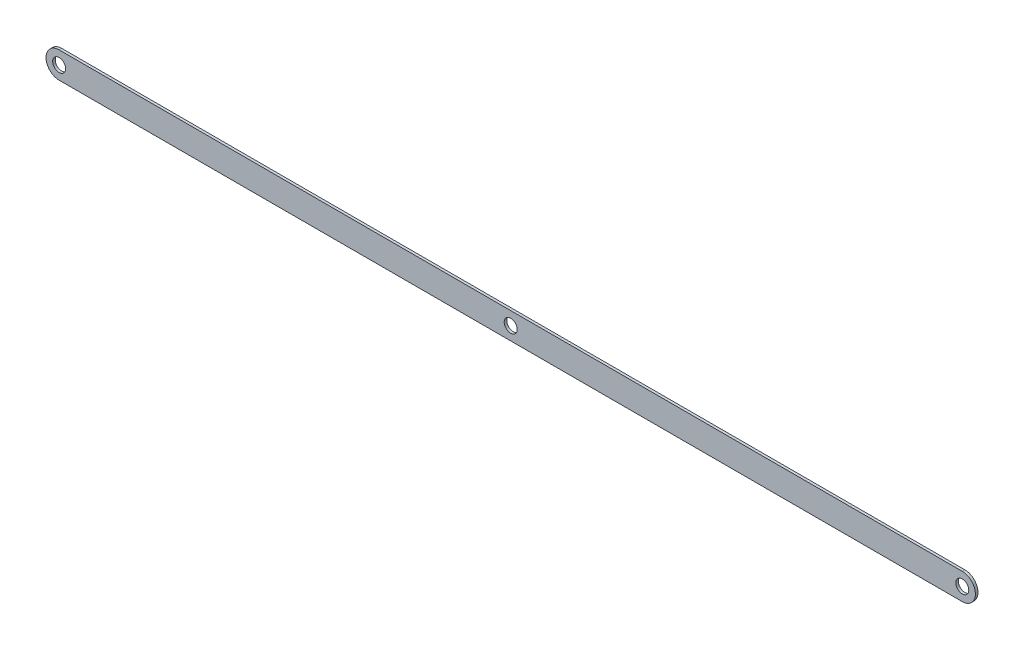
ISO-10303-21;
HEADER;
FILE_DESCRIPTION(('STEP AP214'),'2;1');
FILE_NAME('part.step','',(''),(''),'','','');
FILE_SCHEMA(('AUTOMOTIVE_DESIGN { 1 0 10303 214 1 1 1 1 }'));
ENDSEC;
DATA;
#1=APPLICATION_CONTEXT('core data for automotive mechanical design processes');
#2=APPLICATION_PROTOCOL_DEFINITION('international standard','automotive_design',2000,#1);
#3=PRODUCT_CONTEXT('',#1,'mechanical');
#4=PRODUCT('Part','Part','',(#3));
#5=PRODUCT_RELATED_PRODUCT_CATEGORY('part','',(#4));
#6=PRODUCT_DEFINITION_FORMATION('','',#4);
#7=PRODUCT_DEFINITION_CONTEXT('part definition',#1,'design');
#8=PRODUCT_DEFINITION('design','',#6,#7);
#9=PRODUCT_DEFINITION_SHAPE('','',#8);
#10=(LENGTH_UNIT() NAMED_UNIT(*) SI_UNIT(.MILLI.,.METRE.));
#11=(NAMED_UNIT(*) PLANE_ANGLE_UNIT() SI_UNIT($,.RADIAN.));
#12=(NAMED_UNIT(*) SI_UNIT($,.STERADIAN.) SOLID_ANGLE_UNIT());
#13=UNCERTAINTY_MEASURE_WITH_UNIT(LENGTH_MEASURE(1.E-05),#10,'distance_accuracy_value','');
#14=(GEOMETRIC_REPRESENTATION_CONTEXT(3) GLOBAL_UNCERTAINTY_ASSIGNED_CONTEXT((#13)) GLOBAL_UNIT_ASSIGNED_CONTEXT((#10,
#11,#12)) REPRESENTATION_CONTEXT('',''));
#15=CARTESIAN_POINT('',(0.,0.,0.));
#16=DIRECTION('',(0.,0.,1.));
#17=DIRECTION('',(1.,0.,0.));
#18=AXIS2_PLACEMENT_3D('',#15,#16,#17);
#19=CARTESIAN_POINT('',(-1738.65,0.,10.));
#20=DIRECTION('',(0.,0.,-1.));
#21=DIRECTION('',(-1.,0.,0.));
#22=AXIS2_PLACEMENT_3D('',#19,#20,#21);
#23=CYLINDRICAL_SURFACE('',#22,50.5900452488687);
#24=CARTESIAN_POINT('',(-1738.65,0.,0.));
#25=DIRECTION('',(0.,0.,1.));
#26=DIRECTION('',(1.,0.,0.));
#27=AXIS2_PLACEMENT_3D('',#24,#25,#26);
#28=CIRCLE('',#27,50.5900452488687);
#29=CARTESIAN_POINT('',(-1738.65,50.5900452488687,0.));
#30=VERTEX_POINT('',#29);
#31=CARTESIAN_POINT('',(-1738.65,-50.5900452488687,0.));
#32=VERTEX_POINT('',#31);
#33=EDGE_CURVE('E96',#30,#32,#28,.T.);
#34=ORIENTED_EDGE('',*,*,#33,.T.);
#35=DIRECTION('',(0.,0.,-1.));
#36=VECTOR('',#35,1.);
#37=CARTESIAN_POINT('',(-1738.65,-50.5900452488687,10.));
#38=LINE('',#37,#36);
#39=CARTESIAN_POINT('',(-1738.65,-50.5900452488687,10.));
#40=VERTEX_POINT('',#39);
#41=EDGE_CURVE('E11',#40,#32,#38,.T.);
#42=ORIENTED_EDGE('',*,*,#41,.F.);
#43=CARTESIAN_POINT('',(-1738.65,0.,10.));
#44=DIRECTION('',(0.,0.,1.));
#45=DIRECTION('',(1.,0.,0.));
#46=AXIS2_PLACEMENT_3D('',#43,#44,#45);
#47=CIRCLE('',#46,50.5900452488687);
#48=CARTESIAN_POINT('',(-1738.65,50.5900452488687,10.));
#49=VERTEX_POINT('',#48);
#50=EDGE_CURVE('E84',#49,#40,#47,.T.);
#51=ORIENTED_EDGE('',*,*,#50,.F.);
#52=DIRECTION('',(0.,0.,-1.));
#53=VECTOR('',#52,1.);
#54=CARTESIAN_POINT('',(-1738.65,50.5900452488687,10.));
#55=LINE('',#54,#53);
#56=EDGE_CURVE('E92',#49,#30,#55,.T.);
#57=ORIENTED_EDGE('',*,*,#56,.T.);
#58=EDGE_LOOP('',(#34,#42,#51,#57));
#59=FACE_BOUND('',#58,.T.);
#60=ADVANCED_FACE('F33',(#59),#23,.T.);
#61=CARTESIAN_POINT('',(-1738.65,-50.5900452488687,10.));
#62=DIRECTION('',(0.,1.,0.));
#63=DIRECTION('',(-1.,0.,0.));
#64=AXIS2_PLACEMENT_3D('',#61,#62,#63);
#65=PLANE('',#64);
#66=DIRECTION('',(1.,0.,0.));
#67=VECTOR('',#66,1.);
#68=CARTESIAN_POINT('',(-1738.65,-50.5900452488687,0.));
#69=LINE('',#68,#67);
#70=CARTESIAN_POINT('',(1738.65,-50.5900452488681,0.));
#71=VERTEX_POINT('',#70);
#72=EDGE_CURVE('E88',#32,#71,#69,.T.);
#73=ORIENTED_EDGE('',*,*,#72,.T.);
#74=DIRECTION('',(0.,0.,-1.));
#75=VECTOR('',#74,1.);
#76=CARTESIAN_POINT('',(1738.65,-50.5900452488681,10.));
#77=LINE('',#76,#75);
#78=CARTESIAN_POINT('',(1738.65,-50.5900452488681,10.));
#79=VERTEX_POINT('',#78);
#80=EDGE_CURVE('E41',#79,#71,#77,.T.);
#81=ORIENTED_EDGE('',*,*,#80,.F.);
#82=DIRECTION('',(1.,0.,0.));
#83=VECTOR('',#82,1.);
#84=CARTESIAN_POINT('',(-1738.65,-50.5900452488687,10.));
#85=LINE('',#84,#83);
#86=EDGE_CURVE('E79',#40,#79,#85,.T.);
#87=ORIENTED_EDGE('',*,*,#86,.F.);
#88=ORIENTED_EDGE('',*,*,#41,.T.);
#89=EDGE_LOOP('',(#73,#81,#87,#88));
#90=FACE_BOUND('',#89,.T.);
#91=ADVANCED_FACE('F87',(#90),#65,.F.);
#92=CARTESIAN_POINT('',(1738.65,6.38769647201264E-13,10.));
#93=DIRECTION('',(0.,0.,-1.));
#94=DIRECTION('',(-1.,0.,0.));
#95=AXIS2_PLACEMENT_3D('',#92,#93,#94);
#96=CYLINDRICAL_SURFACE('',#95,50.5900452488687);
#97=CARTESIAN_POINT('',(1738.65,6.38769647201264E-13,0.));
#98=DIRECTION('',(0.,0.,1.));
#99=DIRECTION('',(1.,0.,0.));
#100=AXIS2_PLACEMENT_3D('',#97,#98,#99);
#101=CIRCLE('',#100,50.5900452488687);
#102=CARTESIAN_POINT('',(1738.65,50.5900452488694,0.));
#103=VERTEX_POINT('',#102);
#104=EDGE_CURVE('E66',#71,#103,#101,.T.);
#105=ORIENTED_EDGE('',*,*,#104,.T.);
#106=DIRECTION('',(0.,0.,-1.));
#107=VECTOR('',#106,1.);
#108=CARTESIAN_POINT('',(1738.65,50.5900452488694,10.));
#109=LINE('',#108,#107);
#110=CARTESIAN_POINT('',(1738.65,50.5900452488694,10.));
#111=VERTEX_POINT('',#110);
#112=EDGE_CURVE('E89',#111,#103,#109,.T.);
#113=ORIENTED_EDGE('',*,*,#112,.F.);
#114=CARTESIAN_POINT('',(1738.65,6.38769647201264E-13,10.));
#115=DIRECTION('',(0.,0.,1.));
#116=DIRECTION('',(1.,0.,0.));
#117=AXIS2_PLACEMENT_3D('',#114,#115,#116);
#118=CIRCLE('',#117,50.5900452488687);
#119=EDGE_CURVE('E82',#79,#111,#118,.T.);
#120=ORIENTED_EDGE('',*,*,#119,.F.);
#121=ORIENTED_EDGE('',*,*,#80,.T.);
#122=EDGE_LOOP('',(#105,#113,#120,#121));
#123=FACE_BOUND('',#122,.T.);
#124=ADVANCED_FACE('F90',(#123),#96,.T.);
#125=CARTESIAN_POINT('',(-1738.65,50.5900452488687,10.));
#126=DIRECTION('',(0.,-1.,0.));
#127=DIRECTION('',(1.,0.,0.));
#128=AXIS2_PLACEMENT_3D('',#125,#126,#127);
#129=PLANE('',#128);
#130=DIRECTION('',(-1.,0.,0.));
#131=VECTOR('',#130,1.);
#132=CARTESIAN_POINT('',(-1738.65,50.5900452488687,0.));
#133=LINE('',#132,#131);
#134=EDGE_CURVE('E72',#103,#30,#133,.T.);
#135=ORIENTED_EDGE('',*,*,#134,.T.);
#136=ORIENTED_EDGE('',*,*,#56,.F.);
#137=DIRECTION('',(-1.,0.,0.));
#138=VECTOR('',#137,1.);
#139=CARTESIAN_POINT('',(-1738.65,50.5900452488687,10.));
#140=LINE('',#139,#138);
#141=EDGE_CURVE('E49',#111,#49,#140,.T.);
#142=ORIENTED_EDGE('',*,*,#141,.F.);
#143=ORIENTED_EDGE('',*,*,#112,.T.);
#144=EDGE_LOOP('',(#135,#136,#142,#143));
#145=FACE_BOUND('',#144,.T.);
#146=ADVANCED_FACE('F104',(#145),#129,.F.);
#147=CARTESIAN_POINT('',(-1738.65,0.,10.));
#148=DIRECTION('',(0.,0.,1.));
#149=DIRECTION('',(1.,0.,0.));
#150=AXIS2_PLACEMENT_3D('',#147,#148,#149);
#151=PLANE('',#150);
#152=CARTESIAN_POINT('',(1738.65,6.38769647201264E-13,10.));
#153=DIRECTION('',(0.,0.,1.));
#154=DIRECTION('',(1.,0.,0.));
#155=AXIS2_PLACEMENT_3D('',#152,#153,#154);
#156=CIRCLE('',#155,25.);
#157=CARTESIAN_POINT('',(1763.65,6.38769647201264E-13,10.));
#158=VERTEX_POINT('',#157);
#159=EDGE_CURVE('E116',#158,#158,#156,.T.);
#160=ORIENTED_EDGE('',*,*,#159,.F.);
#161=EDGE_LOOP('',(#160));
#162=FACE_BOUND('',#161,.T.);
#163=CARTESIAN_POINT('',(-1738.65,0.,10.));
#164=DIRECTION('',(0.,0.,1.));
#165=DIRECTION('',(1.,0.,0.));
#166=AXIS2_PLACEMENT_3D('',#163,#164,#165);
#167=CIRCLE('',#166,25.);
#168=CARTESIAN_POINT('',(-1713.65,0.,10.));
#169=VERTEX_POINT('',#168);
#170=EDGE_CURVE('E122',#169,#169,#167,.T.);
#171=ORIENTED_EDGE('',*,*,#170,.F.);
#172=EDGE_LOOP('',(#171));
#173=FACE_BOUND('',#172,.T.);
#174=CARTESIAN_POINT('',(0.,0.,10.));
#175=DIRECTION('',(0.,0.,1.));
#176=DIRECTION('',(1.,0.,0.));
#177=AXIS2_PLACEMENT_3D('',#174,#175,#176);
#178=CIRCLE('',#177,25.);
#179=CARTESIAN_POINT('',(25.,0.,10.));
#180=VERTEX_POINT('',#179);
#181=EDGE_CURVE('E110',#180,#180,#178,.T.);
#182=ORIENTED_EDGE('',*,*,#181,.F.);
#183=EDGE_LOOP('',(#182));
#184=FACE_BOUND('',#183,.T.);
#185=ORIENTED_EDGE('',*,*,#50,.T.);
#186=ORIENTED_EDGE('',*,*,#86,.T.);
#187=ORIENTED_EDGE('',*,*,#119,.T.);
#188=ORIENTED_EDGE('',*,*,#141,.T.);
#189=EDGE_LOOP('',(#185,#186,#187,#188));
#190=FACE_BOUND('',#189,.T.);
#191=ADVANCED_FACE('F80',(#162,#173,#184,#190),#151,.T.);
#192=CARTESIAN_POINT('',(-1738.65,0.,0.));
#193=DIRECTION('',(0.,0.,1.));
#194=DIRECTION('',(1.,0.,0.));
#195=AXIS2_PLACEMENT_3D('',#192,#193,#194);
#196=PLANE('',#195);
#197=CARTESIAN_POINT('',(1738.65,6.38769647201264E-13,0.));
#198=DIRECTION('',(0.,0.,1.));
#199=DIRECTION('',(1.,0.,0.));
#200=AXIS2_PLACEMENT_3D('',#197,#198,#199);
#201=CIRCLE('',#200,25.);
#202=CARTESIAN_POINT('',(1763.65,6.38769647201264E-13,0.));
#203=VERTEX_POINT('',#202);
#204=EDGE_CURVE('E119',#203,#203,#201,.T.);
#205=ORIENTED_EDGE('',*,*,#204,.T.);
#206=EDGE_LOOP('',(#205));
#207=FACE_BOUND('',#206,.T.);
#208=CARTESIAN_POINT('',(-1738.65,0.,0.));
#209=DIRECTION('',(0.,0.,1.));
#210=DIRECTION('',(1.,0.,0.));
#211=AXIS2_PLACEMENT_3D('',#208,#209,#210);
#212=CIRCLE('',#211,25.);
#213=CARTESIAN_POINT('',(-1713.65,0.,0.));
#214=VERTEX_POINT('',#213);
#215=EDGE_CURVE('E113',#214,#214,#212,.T.);
#216=ORIENTED_EDGE('',*,*,#215,.T.);
#217=EDGE_LOOP('',(#216));
#218=FACE_BOUND('',#217,.T.);
#219=CARTESIAN_POINT('',(0.,0.,0.));
#220=DIRECTION('',(0.,0.,1.));
#221=DIRECTION('',(1.,0.,0.));
#222=AXIS2_PLACEMENT_3D('',#219,#220,#221);
#223=CIRCLE('',#222,25.);
#224=CARTESIAN_POINT('',(25.,0.,0.));
#225=VERTEX_POINT('',#224);
#226=EDGE_CURVE('E99',#225,#225,#223,.T.);
#227=ORIENTED_EDGE('',*,*,#226,.T.);
#228=EDGE_LOOP('',(#227));
#229=FACE_BOUND('',#228,.T.);
#230=ORIENTED_EDGE('',*,*,#33,.F.);
#231=ORIENTED_EDGE('',*,*,#134,.F.);
#232=ORIENTED_EDGE('',*,*,#104,.F.);
#233=ORIENTED_EDGE('',*,*,#72,.F.);
#234=EDGE_LOOP('',(#230,#231,#232,#233));
#235=FACE_BOUND('',#234,.T.);
#236=ADVANCED_FACE('F107',(#207,#218,#229,#235),#196,.F.);
#237=CARTESIAN_POINT('',(0.,0.,0.));
#238=DIRECTION('',(0.,0.,1.));
#239=DIRECTION('',(1.,0.,0.));
#240=AXIS2_PLACEMENT_3D('',#237,#238,#239);
#241=CYLINDRICAL_SURFACE('',#240,25.);
#242=ORIENTED_EDGE('',*,*,#226,.F.);
#243=EDGE_LOOP('',(#242));
#244=FACE_BOUND('',#243,.T.);
#245=ORIENTED_EDGE('',*,*,#181,.T.);
#246=EDGE_LOOP('',(#245));
#247=FACE_BOUND('',#246,.T.);
#248=ADVANCED_FACE('F134',(#244,#247),#241,.F.);
#249=CARTESIAN_POINT('',(-1738.65,0.,0.));
#250=DIRECTION('',(0.,0.,1.));
#251=DIRECTION('',(1.,0.,0.));
#252=AXIS2_PLACEMENT_3D('',#249,#250,#251);
#253=CYLINDRICAL_SURFACE('',#252,25.);
#254=ORIENTED_EDGE('',*,*,#215,.F.);
#255=EDGE_LOOP('',(#254));
#256=FACE_BOUND('',#255,.T.);
#257=ORIENTED_EDGE('',*,*,#170,.T.);
#258=EDGE_LOOP('',(#257));
#259=FACE_BOUND('',#258,.T.);
#260=ADVANCED_FACE('F130',(#256,#259),#253,.F.);
#261=CARTESIAN_POINT('',(1738.65,6.38769647201264E-13,0.));
#262=DIRECTION('',(0.,0.,1.));
#263=DIRECTION('',(1.,0.,0.));
#264=AXIS2_PLACEMENT_3D('',#261,#262,#263);
#265=CYLINDRICAL_SURFACE('',#264,25.);
#266=ORIENTED_EDGE('',*,*,#204,.F.);
#267=EDGE_LOOP('',(#266));
#268=FACE_BOUND('',#267,.T.);
#269=ORIENTED_EDGE('',*,*,#159,.T.);
#270=EDGE_LOOP('',(#269));
#271=FACE_BOUND('',#270,.T.);
#272=ADVANCED_FACE('F133',(#268,#271),#265,.F.);
#273=CLOSED_SHELL('',(#60,#91,#124,#146,#191,#236,#248,#260,#272));
#274=MANIFOLD_SOLID_BREP('B2',#273);
#275=ADVANCED_BREP_SHAPE_REPRESENTATION('',(#18,#274),#14);
#276=SHAPE_DEFINITION_REPRESENTATION(#9,#275);
ENDSEC;
END-ISO-10303-21;
